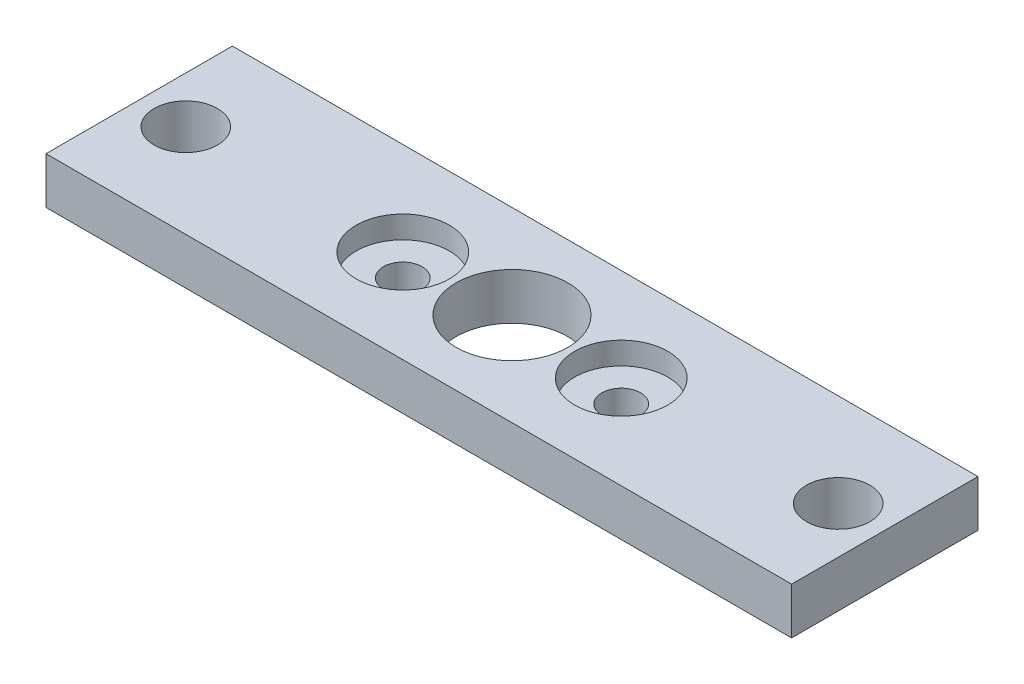
ISO-10303-21;
HEADER;
FILE_DESCRIPTION(('STEP AP214'),'2;1');
FILE_NAME('part.step','',(''),(''),'','','');
FILE_SCHEMA(('AUTOMOTIVE_DESIGN { 1 0 10303 214 1 1 1 1 }'));
ENDSEC;
DATA;
#1=APPLICATION_CONTEXT('core data for automotive mechanical design processes');
#2=APPLICATION_PROTOCOL_DEFINITION('international standard','automotive_design',2000,#1);
#3=PRODUCT_CONTEXT('',#1,'mechanical');
#4=PRODUCT('Part','Part','',(#3));
#5=PRODUCT_RELATED_PRODUCT_CATEGORY('part','',(#4));
#6=PRODUCT_DEFINITION_FORMATION('','',#4);
#7=PRODUCT_DEFINITION_CONTEXT('part definition',#1,'design');
#8=PRODUCT_DEFINITION('design','',#6,#7);
#9=PRODUCT_DEFINITION_SHAPE('','',#8);
#10=(LENGTH_UNIT() NAMED_UNIT(*) SI_UNIT(.MILLI.,.METRE.));
#11=(NAMED_UNIT(*) PLANE_ANGLE_UNIT() SI_UNIT($,.RADIAN.));
#12=(NAMED_UNIT(*) SI_UNIT($,.STERADIAN.) SOLID_ANGLE_UNIT());
#13=UNCERTAINTY_MEASURE_WITH_UNIT(LENGTH_MEASURE(1.E-05),#10,'distance_accuracy_value','');
#14=(GEOMETRIC_REPRESENTATION_CONTEXT(3) GLOBAL_UNCERTAINTY_ASSIGNED_CONTEXT((#13)) GLOBAL_UNIT_ASSIGNED_CONTEXT((#10,
#11,#12)) REPRESENTATION_CONTEXT('',''));
#15=CARTESIAN_POINT('',(0.,0.,0.));
#16=DIRECTION('',(0.,0.,1.));
#17=DIRECTION('',(1.,0.,0.));
#18=AXIS2_PLACEMENT_3D('',#15,#16,#17);
#19=CARTESIAN_POINT('',(7.4422,3.175,0.));
#20=DIRECTION('',(0.,-1.,0.));
#21=DIRECTION('',(0.,0.,-1.));
#22=AXIS2_PLACEMENT_3D('',#19,#20,#21);
#23=CYLINDRICAL_SURFACE('',#22,1.3208);
#24=CARTESIAN_POINT('',(7.4422,0.,0.));
#25=DIRECTION('',(0.,1.,0.));
#26=DIRECTION('',(0.,0.,1.));
#27=AXIS2_PLACEMENT_3D('',#24,#25,#26);
#28=CIRCLE('',#27,1.3208);
#29=CARTESIAN_POINT('',(7.4422,0.,1.3208));
#30=VERTEX_POINT('',#29);
#31=EDGE_CURVE('E122',#30,#30,#28,.T.);
#32=ORIENTED_EDGE('',*,*,#31,.F.);
#33=EDGE_LOOP('',(#32));
#34=FACE_BOUND('',#33,.T.);
#35=CARTESIAN_POINT('',(7.4422,1.651,0.));
#36=DIRECTION('',(0.,1.,0.));
#37=DIRECTION('',(0.,0.,1.));
#38=AXIS2_PLACEMENT_3D('',#35,#36,#37);
#39=CIRCLE('',#38,1.3208);
#40=CARTESIAN_POINT('',(7.4422,1.651,1.3208));
#41=VERTEX_POINT('',#40);
#42=EDGE_CURVE('E50',#41,#41,#39,.T.);
#43=ORIENTED_EDGE('',*,*,#42,.T.);
#44=EDGE_LOOP('',(#43));
#45=FACE_BOUND('',#44,.T.);
#46=ADVANCED_FACE('F46',(#34,#45),#23,.F.);
#47=CARTESIAN_POINT('',(-7.4422,3.175,0.));
#48=DIRECTION('',(0.,-1.,0.));
#49=DIRECTION('',(0.,0.,-1.));
#50=AXIS2_PLACEMENT_3D('',#47,#48,#49);
#51=CYLINDRICAL_SURFACE('',#50,1.3208);
#52=CARTESIAN_POINT('',(-7.4422,0.,0.));
#53=DIRECTION('',(0.,1.,0.));
#54=DIRECTION('',(0.,0.,1.));
#55=AXIS2_PLACEMENT_3D('',#52,#53,#54);
#56=CIRCLE('',#55,1.3208);
#57=CARTESIAN_POINT('',(-7.4422,0.,1.3208));
#58=VERTEX_POINT('',#57);
#59=EDGE_CURVE('E119',#58,#58,#56,.T.);
#60=ORIENTED_EDGE('',*,*,#59,.F.);
#61=EDGE_LOOP('',(#60));
#62=FACE_BOUND('',#61,.T.);
#63=CARTESIAN_POINT('',(-7.4422,1.651,0.));
#64=DIRECTION('',(0.,1.,0.));
#65=DIRECTION('',(0.,0.,1.));
#66=AXIS2_PLACEMENT_3D('',#63,#64,#65);
#67=CIRCLE('',#66,1.3208);
#68=CARTESIAN_POINT('',(-7.4422,1.651,1.3208));
#69=VERTEX_POINT('',#68);
#70=EDGE_CURVE('E138',#69,#69,#67,.T.);
#71=ORIENTED_EDGE('',*,*,#70,.T.);
#72=EDGE_LOOP('',(#71));
#73=FACE_BOUND('',#72,.T.);
#74=ADVANCED_FACE('F187',(#62,#73),#51,.F.);
#75=CARTESIAN_POINT('',(0.,3.175,6.35));
#76=DIRECTION('',(0.,0.,-1.));
#77=DIRECTION('',(-1.,0.,0.));
#78=AXIS2_PLACEMENT_3D('',#75,#76,#77);
#79=PLANE('',#78);
#80=DIRECTION('',(1.,0.,0.));
#81=VECTOR('',#80,1.);
#82=CARTESIAN_POINT('',(0.,0.,6.35));
#83=LINE('',#82,#81);
#84=CARTESIAN_POINT('',(-25.4,0.,6.35));
#85=VERTEX_POINT('',#84);
#86=CARTESIAN_POINT('',(25.4,0.,6.35));
#87=VERTEX_POINT('',#86);
#88=EDGE_CURVE('E128',#85,#87,#83,.T.);
#89=ORIENTED_EDGE('',*,*,#88,.T.);
#90=DIRECTION('',(0.,-1.,0.));
#91=VECTOR('',#90,1.);
#92=CARTESIAN_POINT('',(25.4,3.175,6.35));
#93=LINE('',#92,#91);
#94=CARTESIAN_POINT('',(25.4,3.175,6.35));
#95=VERTEX_POINT('',#94);
#96=EDGE_CURVE('E13',#95,#87,#93,.T.);
#97=ORIENTED_EDGE('',*,*,#96,.F.);
#98=DIRECTION('',(1.,0.,0.));
#99=VECTOR('',#98,1.);
#100=CARTESIAN_POINT('',(0.,3.175,6.35));
#101=LINE('',#100,#99);
#102=CARTESIAN_POINT('',(-25.4,3.175,6.35));
#103=VERTEX_POINT('',#102);
#104=EDGE_CURVE('E98',#103,#95,#101,.T.);
#105=ORIENTED_EDGE('',*,*,#104,.F.);
#106=DIRECTION('',(0.,-1.,0.));
#107=VECTOR('',#106,1.);
#108=CARTESIAN_POINT('',(-25.4,3.175,6.35));
#109=LINE('',#108,#107);
#110=EDGE_CURVE('E65',#103,#85,#109,.T.);
#111=ORIENTED_EDGE('',*,*,#110,.T.);
#112=EDGE_LOOP('',(#89,#97,#105,#111));
#113=FACE_BOUND('',#112,.T.);
#114=ADVANCED_FACE('F193',(#113),#79,.F.);
#115=CARTESIAN_POINT('',(25.4,3.175,0.));
#116=DIRECTION('',(-1.,0.,0.));
#117=DIRECTION('',(0.,0.,1.));
#118=AXIS2_PLACEMENT_3D('',#115,#116,#117);
#119=PLANE('',#118);
#120=DIRECTION('',(0.,0.,-1.));
#121=VECTOR('',#120,1.);
#122=CARTESIAN_POINT('',(25.4,0.,0.));
#123=LINE('',#122,#121);
#124=CARTESIAN_POINT('',(25.4,0.,-6.35));
#125=VERTEX_POINT('',#124);
#126=EDGE_CURVE('E103',#87,#125,#123,.T.);
#127=ORIENTED_EDGE('',*,*,#126,.T.);
#128=DIRECTION('',(0.,-1.,0.));
#129=VECTOR('',#128,1.);
#130=CARTESIAN_POINT('',(25.4,3.175,-6.35));
#131=LINE('',#130,#129);
#132=CARTESIAN_POINT('',(25.4,3.175,-6.35));
#133=VERTEX_POINT('',#132);
#134=EDGE_CURVE('E56',#133,#125,#131,.T.);
#135=ORIENTED_EDGE('',*,*,#134,.F.);
#136=DIRECTION('',(0.,0.,-1.));
#137=VECTOR('',#136,1.);
#138=CARTESIAN_POINT('',(25.4,3.175,0.));
#139=LINE('',#138,#137);
#140=EDGE_CURVE('E90',#95,#133,#139,.T.);
#141=ORIENTED_EDGE('',*,*,#140,.F.);
#142=ORIENTED_EDGE('',*,*,#96,.T.);
#143=EDGE_LOOP('',(#127,#135,#141,#142));
#144=FACE_BOUND('',#143,.T.);
#145=ADVANCED_FACE('F102',(#144),#119,.F.);
#146=CARTESIAN_POINT('',(0.,3.175,-6.35));
#147=DIRECTION('',(0.,0.,-1.));
#148=DIRECTION('',(-1.,0.,0.));
#149=AXIS2_PLACEMENT_3D('',#146,#147,#148);
#150=PLANE('',#149);
#151=DIRECTION('',(1.,0.,0.));
#152=VECTOR('',#151,1.);
#153=CARTESIAN_POINT('',(0.,0.,-6.35));
#154=LINE('',#153,#152);
#155=CARTESIAN_POINT('',(-25.4,0.,-6.35));
#156=VERTEX_POINT('',#155);
#157=EDGE_CURVE('E131',#156,#125,#154,.T.);
#158=ORIENTED_EDGE('',*,*,#157,.F.);
#159=DIRECTION('',(0.,-1.,0.));
#160=VECTOR('',#159,1.);
#161=CARTESIAN_POINT('',(-25.4,3.175,-6.35));
#162=LINE('',#161,#160);
#163=CARTESIAN_POINT('',(-25.4,3.175,-6.35));
#164=VERTEX_POINT('',#163);
#165=EDGE_CURVE('E79',#164,#156,#162,.T.);
#166=ORIENTED_EDGE('',*,*,#165,.F.);
#167=DIRECTION('',(1.,0.,0.));
#168=VECTOR('',#167,1.);
#169=CARTESIAN_POINT('',(0.,3.175,-6.35));
#170=LINE('',#169,#168);
#171=EDGE_CURVE('E97',#164,#133,#170,.T.);
#172=ORIENTED_EDGE('',*,*,#171,.T.);
#173=ORIENTED_EDGE('',*,*,#134,.T.);
#174=EDGE_LOOP('',(#158,#166,#172,#173));
#175=FACE_BOUND('',#174,.T.);
#176=ADVANCED_FACE('F107',(#175),#150,.T.);
#177=CARTESIAN_POINT('',(0.,3.175,0.));
#178=DIRECTION('',(0.,-1.,0.));
#179=DIRECTION('',(0.,0.,-1.));
#180=AXIS2_PLACEMENT_3D('',#177,#178,#179);
#181=CYLINDRICAL_SURFACE('',#180,3.81);
#182=CARTESIAN_POINT('',(0.,3.175,0.));
#183=DIRECTION('',(0.,1.,0.));
#184=DIRECTION('',(0.,0.,1.));
#185=AXIS2_PLACEMENT_3D('',#182,#183,#184);
#186=CIRCLE('',#185,3.81);
#187=CARTESIAN_POINT('',(0.,3.175,3.81));
#188=VERTEX_POINT('',#187);
#189=EDGE_CURVE('E163',#188,#188,#186,.T.);
#190=ORIENTED_EDGE('',*,*,#189,.T.);
#191=EDGE_LOOP('',(#190));
#192=FACE_BOUND('',#191,.T.);
#193=CARTESIAN_POINT('',(0.,0.,0.));
#194=DIRECTION('',(0.,1.,0.));
#195=DIRECTION('',(0.,0.,1.));
#196=AXIS2_PLACEMENT_3D('',#193,#194,#195);
#197=CIRCLE('',#196,3.81);
#198=CARTESIAN_POINT('',(0.,0.,3.81));
#199=VERTEX_POINT('',#198);
#200=EDGE_CURVE('E125',#199,#199,#197,.T.);
#201=ORIENTED_EDGE('',*,*,#200,.F.);
#202=EDGE_LOOP('',(#201));
#203=FACE_BOUND('',#202,.T.);
#204=ADVANCED_FACE('F167',(#192,#203),#181,.F.);
#205=CARTESIAN_POINT('',(-22.225,3.175,0.));
#206=DIRECTION('',(0.,-1.,0.));
#207=DIRECTION('',(0.,0.,-1.));
#208=AXIS2_PLACEMENT_3D('',#205,#206,#207);
#209=CYLINDRICAL_SURFACE('',#208,2.159);
#210=CARTESIAN_POINT('',(-22.225,3.175,0.));
#211=DIRECTION('',(0.,1.,0.));
#212=DIRECTION('',(0.,0.,1.));
#213=AXIS2_PLACEMENT_3D('',#210,#211,#212);
#214=CIRCLE('',#213,2.159);
#215=CARTESIAN_POINT('',(-22.225,3.175,2.159));
#216=VERTEX_POINT('',#215);
#217=EDGE_CURVE('E160',#216,#216,#214,.T.);
#218=ORIENTED_EDGE('',*,*,#217,.T.);
#219=EDGE_LOOP('',(#218));
#220=FACE_BOUND('',#219,.T.);
#221=CARTESIAN_POINT('',(-22.225,0.,0.));
#222=DIRECTION('',(0.,1.,0.));
#223=DIRECTION('',(0.,0.,1.));
#224=AXIS2_PLACEMENT_3D('',#221,#222,#223);
#225=CIRCLE('',#224,2.159);
#226=CARTESIAN_POINT('',(-22.225,0.,2.159));
#227=VERTEX_POINT('',#226);
#228=EDGE_CURVE('E116',#227,#227,#225,.T.);
#229=ORIENTED_EDGE('',*,*,#228,.F.);
#230=EDGE_LOOP('',(#229));
#231=FACE_BOUND('',#230,.T.);
#232=ADVANCED_FACE('F200',(#220,#231),#209,.F.);
#233=CARTESIAN_POINT('',(22.225,3.175,0.));
#234=DIRECTION('',(0.,-1.,0.));
#235=DIRECTION('',(0.,0.,-1.));
#236=AXIS2_PLACEMENT_3D('',#233,#234,#235);
#237=CYLINDRICAL_SURFACE('',#236,2.159);
#238=CARTESIAN_POINT('',(22.225,3.175,0.));
#239=DIRECTION('',(0.,1.,0.));
#240=DIRECTION('',(0.,0.,1.));
#241=AXIS2_PLACEMENT_3D('',#238,#239,#240);
#242=CIRCLE('',#241,2.159);
#243=CARTESIAN_POINT('',(22.225,3.175,2.15899999999999));
#244=VERTEX_POINT('',#243);
#245=EDGE_CURVE('E136',#244,#244,#242,.T.);
#246=ORIENTED_EDGE('',*,*,#245,.T.);
#247=EDGE_LOOP('',(#246));
#248=FACE_BOUND('',#247,.T.);
#249=CARTESIAN_POINT('',(22.225,0.,0.));
#250=DIRECTION('',(0.,1.,0.));
#251=DIRECTION('',(0.,0.,1.));
#252=AXIS2_PLACEMENT_3D('',#249,#250,#251);
#253=CIRCLE('',#252,2.159);
#254=CARTESIAN_POINT('',(22.225,0.,2.15899999999999));
#255=VERTEX_POINT('',#254);
#256=EDGE_CURVE('E113',#255,#255,#253,.T.);
#257=ORIENTED_EDGE('',*,*,#256,.F.);
#258=EDGE_LOOP('',(#257));
#259=FACE_BOUND('',#258,.T.);
#260=ADVANCED_FACE('F48',(#248,#259),#237,.F.);
#261=CARTESIAN_POINT('',(-25.4,3.175,0.));
#262=DIRECTION('',(-1.,0.,0.));
#263=DIRECTION('',(0.,0.,1.));
#264=AXIS2_PLACEMENT_3D('',#261,#262,#263);
#265=PLANE('',#264);
#266=DIRECTION('',(0.,0.,-1.));
#267=VECTOR('',#266,1.);
#268=CARTESIAN_POINT('',(-25.4,0.,0.));
#269=LINE('',#268,#267);
#270=EDGE_CURVE('E133',#85,#156,#269,.T.);
#271=ORIENTED_EDGE('',*,*,#270,.F.);
#272=ORIENTED_EDGE('',*,*,#110,.F.);
#273=DIRECTION('',(0.,0.,-1.));
#274=VECTOR('',#273,1.);
#275=CARTESIAN_POINT('',(-25.4,3.175,0.));
#276=LINE('',#275,#274);
#277=EDGE_CURVE('E108',#103,#164,#276,.T.);
#278=ORIENTED_EDGE('',*,*,#277,.T.);
#279=ORIENTED_EDGE('',*,*,#165,.T.);
#280=EDGE_LOOP('',(#271,#272,#278,#279));
#281=FACE_BOUND('',#280,.T.);
#282=ADVANCED_FACE('F172',(#281),#265,.T.);
#283=CARTESIAN_POINT('',(0.,3.175,0.));
#284=DIRECTION('',(0.,1.,0.));
#285=DIRECTION('',(0.,0.,1.));
#286=AXIS2_PLACEMENT_3D('',#283,#284,#285);
#287=PLANE('',#286);
#288=CARTESIAN_POINT('',(-7.4422,3.175,0.));
#289=DIRECTION('',(0.,1.,0.));
#290=DIRECTION('',(0.,0.,1.));
#291=AXIS2_PLACEMENT_3D('',#288,#289,#290);
#292=CIRCLE('',#291,3.175);
#293=CARTESIAN_POINT('',(-7.4422,3.175,3.175));
#294=VERTEX_POINT('',#293);
#295=EDGE_CURVE('E145',#294,#294,#292,.T.);
#296=ORIENTED_EDGE('',*,*,#295,.F.);
#297=EDGE_LOOP('',(#296));
#298=FACE_BOUND('',#297,.T.);
#299=CARTESIAN_POINT('',(7.4422,3.175,0.));
#300=DIRECTION('',(0.,1.,0.));
#301=DIRECTION('',(0.,0.,1.));
#302=AXIS2_PLACEMENT_3D('',#299,#300,#301);
#303=CIRCLE('',#302,3.175);
#304=CARTESIAN_POINT('',(7.4422,3.175,3.175));
#305=VERTEX_POINT('',#304);
#306=EDGE_CURVE('E155',#305,#305,#303,.T.);
#307=ORIENTED_EDGE('',*,*,#306,.F.);
#308=EDGE_LOOP('',(#307));
#309=FACE_BOUND('',#308,.T.);
#310=ORIENTED_EDGE('',*,*,#245,.F.);
#311=EDGE_LOOP('',(#310));
#312=FACE_BOUND('',#311,.T.);
#313=ORIENTED_EDGE('',*,*,#217,.F.);
#314=EDGE_LOOP('',(#313));
#315=FACE_BOUND('',#314,.T.);
#316=ORIENTED_EDGE('',*,*,#189,.F.);
#317=EDGE_LOOP('',(#316));
#318=FACE_BOUND('',#317,.T.);
#319=ORIENTED_EDGE('',*,*,#104,.T.);
#320=ORIENTED_EDGE('',*,*,#140,.T.);
#321=ORIENTED_EDGE('',*,*,#171,.F.);
#322=ORIENTED_EDGE('',*,*,#277,.F.);
#323=EDGE_LOOP('',(#319,#320,#321,#322));
#324=FACE_BOUND('',#323,.T.);
#325=ADVANCED_FACE('F94',(#298,#309,#312,#315,#318,#324),#287,.T.);
#326=CARTESIAN_POINT('',(0.,0.,0.));
#327=DIRECTION('',(0.,1.,0.));
#328=DIRECTION('',(0.,0.,1.));
#329=AXIS2_PLACEMENT_3D('',#326,#327,#328);
#330=PLANE('',#329);
#331=ORIENTED_EDGE('',*,*,#256,.T.);
#332=EDGE_LOOP('',(#331));
#333=FACE_BOUND('',#332,.T.);
#334=ORIENTED_EDGE('',*,*,#228,.T.);
#335=EDGE_LOOP('',(#334));
#336=FACE_BOUND('',#335,.T.);
#337=ORIENTED_EDGE('',*,*,#59,.T.);
#338=EDGE_LOOP('',(#337));
#339=FACE_BOUND('',#338,.T.);
#340=ORIENTED_EDGE('',*,*,#31,.T.);
#341=EDGE_LOOP('',(#340));
#342=FACE_BOUND('',#341,.T.);
#343=ORIENTED_EDGE('',*,*,#200,.T.);
#344=EDGE_LOOP('',(#343));
#345=FACE_BOUND('',#344,.T.);
#346=ORIENTED_EDGE('',*,*,#88,.F.);
#347=ORIENTED_EDGE('',*,*,#270,.T.);
#348=ORIENTED_EDGE('',*,*,#157,.T.);
#349=ORIENTED_EDGE('',*,*,#126,.F.);
#350=EDGE_LOOP('',(#346,#347,#348,#349));
#351=FACE_BOUND('',#350,.T.);
#352=ADVANCED_FACE('F171',(#333,#336,#339,#342,#345,#351),#330,.F.);
#353=CARTESIAN_POINT('',(7.4422,1.651,0.));
#354=DIRECTION('',(0.,1.,0.));
#355=DIRECTION('',(0.,0.,1.));
#356=AXIS2_PLACEMENT_3D('',#353,#354,#355);
#357=CYLINDRICAL_SURFACE('',#356,3.175);
#358=CARTESIAN_POINT('',(7.4422,1.651,0.));
#359=DIRECTION('',(0.,1.,0.));
#360=DIRECTION('',(0.,0.,1.));
#361=AXIS2_PLACEMENT_3D('',#358,#359,#360);
#362=CIRCLE('',#361,3.175);
#363=CARTESIAN_POINT('',(7.4422,1.651,3.175));
#364=VERTEX_POINT('',#363);
#365=EDGE_CURVE('E150',#364,#364,#362,.T.);
#366=CARTESIAN_POINT('',(7.4422,1.651,3.175));
#367=CARTESIAN_POINT('',(7.4422,1.666875,3.175));
#368=CARTESIAN_POINT('',(7.4422,1.68275,3.175));
#369=CARTESIAN_POINT('',(7.4422,1.7145,3.175));
#370=CARTESIAN_POINT('',(7.4422,1.730375,3.175));
#371=CARTESIAN_POINT('',(7.4422,1.762125,3.175));
#372=CARTESIAN_POINT('',(7.4422,1.778,3.175));
#373=CARTESIAN_POINT('',(7.4422,1.80975,3.175));
#374=CARTESIAN_POINT('',(7.4422,1.825625,3.175));
#375=CARTESIAN_POINT('',(7.4422,1.857375,3.175));
#376=CARTESIAN_POINT('',(7.4422,1.87325,3.175));
#377=CARTESIAN_POINT('',(7.4422,1.905,3.175));
#378=CARTESIAN_POINT('',(7.4422,1.920875,3.175));
#379=CARTESIAN_POINT('',(7.4422,1.952625,3.175));
#380=CARTESIAN_POINT('',(7.4422,1.9685,3.175));
#381=CARTESIAN_POINT('',(7.4422,2.00025,3.175));
#382=CARTESIAN_POINT('',(7.4422,2.016125,3.175));
#383=CARTESIAN_POINT('',(7.4422,2.047875,3.175));
#384=CARTESIAN_POINT('',(7.4422,2.06375,3.175));
#385=CARTESIAN_POINT('',(7.4422,2.0955,3.175));
#386=CARTESIAN_POINT('',(7.4422,2.111375,3.175));
#387=CARTESIAN_POINT('',(7.4422,2.143125,3.175));
#388=CARTESIAN_POINT('',(7.4422,2.159,3.175));
#389=CARTESIAN_POINT('',(7.4422,2.19075,3.175));
#390=CARTESIAN_POINT('',(7.4422,2.206625,3.175));
#391=CARTESIAN_POINT('',(7.4422,2.238375,3.175));
#392=CARTESIAN_POINT('',(7.4422,2.25425,3.175));
#393=CARTESIAN_POINT('',(7.4422,2.286,3.175));
#394=CARTESIAN_POINT('',(7.4422,2.301875,3.175));
#395=CARTESIAN_POINT('',(7.4422,2.333625,3.175));
#396=CARTESIAN_POINT('',(7.4422,2.3495,3.175));
#397=CARTESIAN_POINT('',(7.4422,2.38125,3.175));
#398=CARTESIAN_POINT('',(7.4422,2.397125,3.175));
#399=CARTESIAN_POINT('',(7.4422,2.428875,3.175));
#400=CARTESIAN_POINT('',(7.4422,2.44475,3.175));
#401=CARTESIAN_POINT('',(7.4422,2.4765,3.175));
#402=CARTESIAN_POINT('',(7.4422,2.492375,3.175));
#403=CARTESIAN_POINT('',(7.4422,2.524125,3.175));
#404=CARTESIAN_POINT('',(7.4422,2.54,3.175));
#405=CARTESIAN_POINT('',(7.4422,2.57175,3.175));
#406=CARTESIAN_POINT('',(7.4422,2.587625,3.175));
#407=CARTESIAN_POINT('',(7.4422,2.619375,3.175));
#408=CARTESIAN_POINT('',(7.4422,2.63525,3.175));
#409=CARTESIAN_POINT('',(7.4422,2.667,3.175));
#410=CARTESIAN_POINT('',(7.4422,2.682875,3.175));
#411=CARTESIAN_POINT('',(7.4422,2.714625,3.175));
#412=CARTESIAN_POINT('',(7.4422,2.7305,3.175));
#413=CARTESIAN_POINT('',(7.4422,2.76225,3.175));
#414=CARTESIAN_POINT('',(7.4422,2.778125,3.175));
#415=CARTESIAN_POINT('',(7.4422,2.809875,3.175));
#416=CARTESIAN_POINT('',(7.4422,2.82575,3.175));
#417=CARTESIAN_POINT('',(7.4422,2.8575,3.175));
#418=CARTESIAN_POINT('',(7.4422,2.873375,3.175));
#419=CARTESIAN_POINT('',(7.4422,2.905125,3.175));
#420=CARTESIAN_POINT('',(7.4422,2.921,3.175));
#421=CARTESIAN_POINT('',(7.4422,2.95275,3.175));
#422=CARTESIAN_POINT('',(7.4422,2.968625,3.175));
#423=CARTESIAN_POINT('',(7.4422,3.000375,3.175));
#424=CARTESIAN_POINT('',(7.4422,3.01625,3.175));
#425=CARTESIAN_POINT('',(7.4422,3.048,3.175));
#426=CARTESIAN_POINT('',(7.4422,3.063875,3.175));
#427=CARTESIAN_POINT('',(7.4422,3.095625,3.175));
#428=CARTESIAN_POINT('',(7.4422,3.1115,3.175));
#429=CARTESIAN_POINT('',(7.4422,3.14325,3.175));
#430=CARTESIAN_POINT('',(7.4422,3.159125,3.175));
#431=CARTESIAN_POINT('',(7.4422,3.175,3.175));
#432=B_SPLINE_CURVE_WITH_KNOTS('',3,(#366,#367,#368,#369,#370,#371,#372,#373,#374,#375,#376,
#377,#378,#379,#380,#381,#382,#383,#384,#385,#386,#387,#388,#389,#390,#391,#392,#393,#394,#395,
#396,#397,#398,#399,#400,#401,#402,#403,#404,#405,#406,#407,#408,#409,#410,#411,#412,#413,#414,
#415,#416,#417,#418,#419,#420,#421,#422,#423,#424,#425,#426,#427,#428,#429,#430,#431),
.UNSPECIFIED.,.F.,.F.,(4,2,2,2,2,2,2,2,2,2,2,2,2,2,2,2,2,2,2,2,2,2,2,2,2,2,2,2,2,2,2,2,4),(0.,
0.0476250000000001,0.0952500000000001,0.142875,0.1905,0.238125,0.28575,0.333375,0.381,0.428625,
0.47625,0.523875,0.5715,0.619125,0.66675,0.714375,0.762,0.809625,0.85725,0.904875,0.9525,
1.000125,1.04775,1.095375,1.143,1.190625,1.23825,1.285875,1.3335,1.381125,1.42875,1.476375,
1.524),.UNSPECIFIED.);
#433=EDGE_CURVE('BSEAM179',#364,#305,#432,.T.);
#434=ORIENTED_EDGE('',*,*,#365,.F.);
#435=ORIENTED_EDGE('',*,*,#306,.T.);
#436=ORIENTED_EDGE('',*,*,#433,.T.);
#437=ORIENTED_EDGE('',*,*,#433,.F.);
#438=EDGE_LOOP('',(#434,#436,#435,#437));
#439=FACE_BOUND('',#438,.T.);
#440=ADVANCED_FACE('F179',(#439),#357,.F.);
#441=CARTESIAN_POINT('',(7.4422,1.651,0.));
#442=DIRECTION('',(0.,1.,0.));
#443=DIRECTION('',(0.,0.,1.));
#444=AXIS2_PLACEMENT_3D('',#441,#442,#443);
#445=PLANE('',#444);
#446=ORIENTED_EDGE('',*,*,#42,.F.);
#447=EDGE_LOOP('',(#446));
#448=FACE_BOUND('',#447,.T.);
#449=ORIENTED_EDGE('',*,*,#365,.T.);
#450=EDGE_LOOP('',(#449));
#451=FACE_BOUND('',#450,.T.);
#452=ADVANCED_FACE('F278',(#448,#451),#445,.T.);
#453=CARTESIAN_POINT('',(-7.4422,1.651,0.));
#454=DIRECTION('',(0.,1.,0.));
#455=DIRECTION('',(0.,0.,1.));
#456=AXIS2_PLACEMENT_3D('',#453,#454,#455);
#457=CYLINDRICAL_SURFACE('',#456,3.175);
#458=CARTESIAN_POINT('',(-7.4422,1.651,0.));
#459=DIRECTION('',(0.,1.,0.));
#460=DIRECTION('',(0.,0.,1.));
#461=AXIS2_PLACEMENT_3D('',#458,#459,#460);
#462=CIRCLE('',#461,3.175);
#463=CARTESIAN_POINT('',(-7.4422,1.651,3.175));
#464=VERTEX_POINT('',#463);
#465=EDGE_CURVE('E140',#464,#464,#462,.T.);
#466=CARTESIAN_POINT('',(-7.4422,1.651,3.175));
#467=CARTESIAN_POINT('',(-7.4422,1.666875,3.175));
#468=CARTESIAN_POINT('',(-7.4422,1.68275,3.175));
#469=CARTESIAN_POINT('',(-7.4422,1.7145,3.175));
#470=CARTESIAN_POINT('',(-7.4422,1.730375,3.175));
#471=CARTESIAN_POINT('',(-7.4422,1.762125,3.175));
#472=CARTESIAN_POINT('',(-7.4422,1.778,3.175));
#473=CARTESIAN_POINT('',(-7.4422,1.80975,3.175));
#474=CARTESIAN_POINT('',(-7.4422,1.825625,3.175));
#475=CARTESIAN_POINT('',(-7.4422,1.857375,3.175));
#476=CARTESIAN_POINT('',(-7.4422,1.87325,3.175));
#477=CARTESIAN_POINT('',(-7.4422,1.905,3.175));
#478=CARTESIAN_POINT('',(-7.4422,1.920875,3.175));
#479=CARTESIAN_POINT('',(-7.4422,1.952625,3.175));
#480=CARTESIAN_POINT('',(-7.4422,1.9685,3.175));
#481=CARTESIAN_POINT('',(-7.4422,2.00025,3.175));
#482=CARTESIAN_POINT('',(-7.4422,2.016125,3.175));
#483=CARTESIAN_POINT('',(-7.4422,2.047875,3.175));
#484=CARTESIAN_POINT('',(-7.4422,2.06375,3.175));
#485=CARTESIAN_POINT('',(-7.4422,2.0955,3.175));
#486=CARTESIAN_POINT('',(-7.4422,2.111375,3.175));
#487=CARTESIAN_POINT('',(-7.4422,2.143125,3.175));
#488=CARTESIAN_POINT('',(-7.4422,2.159,3.175));
#489=CARTESIAN_POINT('',(-7.4422,2.19075,3.175));
#490=CARTESIAN_POINT('',(-7.4422,2.206625,3.175));
#491=CARTESIAN_POINT('',(-7.4422,2.238375,3.175));
#492=CARTESIAN_POINT('',(-7.4422,2.25425,3.175));
#493=CARTESIAN_POINT('',(-7.4422,2.286,3.175));
#494=CARTESIAN_POINT('',(-7.4422,2.301875,3.175));
#495=CARTESIAN_POINT('',(-7.4422,2.333625,3.175));
#496=CARTESIAN_POINT('',(-7.4422,2.3495,3.175));
#497=CARTESIAN_POINT('',(-7.4422,2.38125,3.175));
#498=CARTESIAN_POINT('',(-7.4422,2.397125,3.175));
#499=CARTESIAN_POINT('',(-7.4422,2.428875,3.175));
#500=CARTESIAN_POINT('',(-7.4422,2.44475,3.175));
#501=CARTESIAN_POINT('',(-7.4422,2.4765,3.175));
#502=CARTESIAN_POINT('',(-7.4422,2.492375,3.175));
#503=CARTESIAN_POINT('',(-7.4422,2.524125,3.175));
#504=CARTESIAN_POINT('',(-7.4422,2.54,3.175));
#505=CARTESIAN_POINT('',(-7.4422,2.57175,3.175));
#506=CARTESIAN_POINT('',(-7.4422,2.587625,3.175));
#507=CARTESIAN_POINT('',(-7.4422,2.619375,3.175));
#508=CARTESIAN_POINT('',(-7.4422,2.63525,3.175));
#509=CARTESIAN_POINT('',(-7.4422,2.667,3.175));
#510=CARTESIAN_POINT('',(-7.4422,2.682875,3.175));
#511=CARTESIAN_POINT('',(-7.4422,2.714625,3.175));
#512=CARTESIAN_POINT('',(-7.4422,2.7305,3.175));
#513=CARTESIAN_POINT('',(-7.4422,2.76225,3.175));
#514=CARTESIAN_POINT('',(-7.4422,2.778125,3.175));
#515=CARTESIAN_POINT('',(-7.4422,2.809875,3.175));
#516=CARTESIAN_POINT('',(-7.4422,2.82575,3.175));
#517=CARTESIAN_POINT('',(-7.4422,2.8575,3.175));
#518=CARTESIAN_POINT('',(-7.4422,2.873375,3.175));
#519=CARTESIAN_POINT('',(-7.4422,2.905125,3.175));
#520=CARTESIAN_POINT('',(-7.4422,2.921,3.175));
#521=CARTESIAN_POINT('',(-7.4422,2.95275,3.175));
#522=CARTESIAN_POINT('',(-7.4422,2.968625,3.175));
#523=CARTESIAN_POINT('',(-7.4422,3.000375,3.175));
#524=CARTESIAN_POINT('',(-7.4422,3.01625,3.175));
#525=CARTESIAN_POINT('',(-7.4422,3.048,3.175));
#526=CARTESIAN_POINT('',(-7.4422,3.063875,3.175));
#527=CARTESIAN_POINT('',(-7.4422,3.095625,3.175));
#528=CARTESIAN_POINT('',(-7.4422,3.1115,3.175));
#529=CARTESIAN_POINT('',(-7.4422,3.14325,3.175));
#530=CARTESIAN_POINT('',(-7.4422,3.159125,3.175));
#531=CARTESIAN_POINT('',(-7.4422,3.175,3.175));
#532=B_SPLINE_CURVE_WITH_KNOTS('',3,(#466,#467,#468,#469,#470,#471,#472,#473,#474,#475,#476,
#477,#478,#479,#480,#481,#482,#483,#484,#485,#486,#487,#488,#489,#490,#491,#492,#493,#494,#495,
#496,#497,#498,#499,#500,#501,#502,#503,#504,#505,#506,#507,#508,#509,#510,#511,#512,#513,#514,
#515,#516,#517,#518,#519,#520,#521,#522,#523,#524,#525,#526,#527,#528,#529,#530,#531),
.UNSPECIFIED.,.F.,.F.,(4,2,2,2,2,2,2,2,2,2,2,2,2,2,2,2,2,2,2,2,2,2,2,2,2,2,2,2,2,2,2,2,4),(0.,
0.0476250000000001,0.0952500000000001,0.142875,0.1905,0.238125,0.28575,0.333375,0.381,0.428625,
0.47625,0.523875,0.5715,0.619125,0.66675,0.714375,0.762,0.809625,0.85725,0.904875,0.9525,
1.000125,1.04775,1.095375,1.143,1.190625,1.23825,1.285875,1.3335,1.381125,1.42875,1.476375,
1.524),.UNSPECIFIED.);
#533=EDGE_CURVE('BSEAM287',#464,#294,#532,.T.);
#534=ORIENTED_EDGE('',*,*,#465,.F.);
#535=ORIENTED_EDGE('',*,*,#295,.T.);
#536=ORIENTED_EDGE('',*,*,#533,.T.);
#537=ORIENTED_EDGE('',*,*,#533,.F.);
#538=EDGE_LOOP('',(#534,#536,#535,#537));
#539=FACE_BOUND('',#538,.T.);
#540=ADVANCED_FACE('F287',(#539),#457,.F.);
#541=CARTESIAN_POINT('',(-7.4422,1.651,0.));
#542=DIRECTION('',(0.,1.,0.));
#543=DIRECTION('',(0.,0.,1.));
#544=AXIS2_PLACEMENT_3D('',#541,#542,#543);
#545=PLANE('',#544);
#546=ORIENTED_EDGE('',*,*,#70,.F.);
#547=EDGE_LOOP('',(#546));
#548=FACE_BOUND('',#547,.T.);
#549=ORIENTED_EDGE('',*,*,#465,.T.);
#550=EDGE_LOOP('',(#549));
#551=FACE_BOUND('',#550,.T.);
#552=ADVANCED_FACE('F297',(#548,#551),#545,.T.);
#553=CLOSED_SHELL('',(#46,#74,#114,#145,#176,#204,#232,#260,#282,#325,#352,#440,#452,#540,#552));
#554=MANIFOLD_SOLID_BREP('B2',#553);
#555=ADVANCED_BREP_SHAPE_REPRESENTATION('',(#18,#554),#14);
#556=SHAPE_DEFINITION_REPRESENTATION(#9,#555);
ENDSEC;
END-ISO-10303-21;
